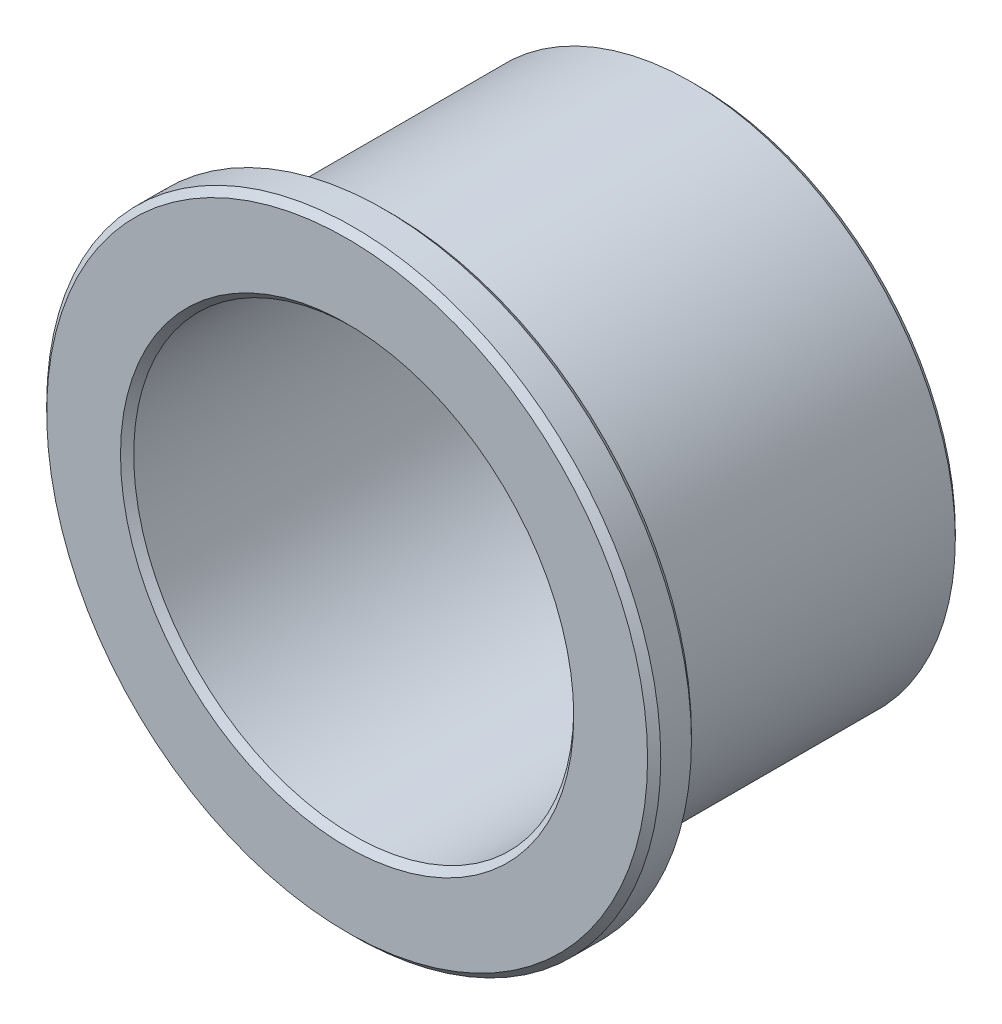
ISO-10303-21;
HEADER;
FILE_DESCRIPTION(('STEP AP214'),'2;1');
FILE_NAME('part.step','',(''),(''),'','','');
FILE_SCHEMA(('AUTOMOTIVE_DESIGN { 1 0 10303 214 1 1 1 1 }'));
ENDSEC;
DATA;
#1=APPLICATION_CONTEXT('core data for automotive mechanical design processes');
#2=APPLICATION_PROTOCOL_DEFINITION('international standard','automotive_design',2000,#1);
#3=PRODUCT_CONTEXT('',#1,'mechanical');
#4=PRODUCT('Part','Part','',(#3));
#5=PRODUCT_RELATED_PRODUCT_CATEGORY('part','',(#4));
#6=PRODUCT_DEFINITION_FORMATION('','',#4);
#7=PRODUCT_DEFINITION_CONTEXT('part definition',#1,'design');
#8=PRODUCT_DEFINITION('design','',#6,#7);
#9=PRODUCT_DEFINITION_SHAPE('','',#8);
#10=(LENGTH_UNIT() NAMED_UNIT(*) SI_UNIT(.MILLI.,.METRE.));
#11=(NAMED_UNIT(*) PLANE_ANGLE_UNIT() SI_UNIT($,.RADIAN.));
#12=(NAMED_UNIT(*) SI_UNIT($,.STERADIAN.) SOLID_ANGLE_UNIT());
#13=UNCERTAINTY_MEASURE_WITH_UNIT(LENGTH_MEASURE(1.E-05),#10,'distance_accuracy_value','');
#14=(GEOMETRIC_REPRESENTATION_CONTEXT(3) GLOBAL_UNCERTAINTY_ASSIGNED_CONTEXT((#13)) GLOBAL_UNIT_ASSIGNED_CONTEXT((#10,
#11,#12)) REPRESENTATION_CONTEXT('',''));
#15=CARTESIAN_POINT('',(0.,0.,0.));
#16=DIRECTION('',(0.,0.,1.));
#17=DIRECTION('',(1.,0.,0.));
#18=AXIS2_PLACEMENT_3D('',#15,#16,#17);
#19=CARTESIAN_POINT('',(0.,0.,4.7625));
#20=DIRECTION('',(0.,0.,1.));
#21=DIRECTION('',(1.,0.,0.));
#22=AXIS2_PLACEMENT_3D('',#19,#20,#21);
#23=CYLINDRICAL_SURFACE('',#22,11.1125);
#24=CARTESIAN_POINT('',(0.,0.,6.11111300000001));
#25=DIRECTION('',(0.,0.,1.));
#26=DIRECTION('',(1.,0.,0.));
#27=AXIS2_PLACEMENT_3D('',#24,#25,#26);
#28=CIRCLE('',#27,11.1125);
#29=CARTESIAN_POINT('',(11.1125,0.,6.11111300000001));
#30=VERTEX_POINT('',#29);
#31=EDGE_CURVE('E58',#30,#30,#28,.F.);
#32=ORIENTED_EDGE('',*,*,#31,.T.);
#33=EDGE_LOOP('',(#32));
#34=FACE_BOUND('',#33,.T.);
#35=CARTESIAN_POINT('',(0.,0.,5.001387));
#36=DIRECTION('',(0.,0.,1.));
#37=DIRECTION('',(1.,0.,0.));
#38=AXIS2_PLACEMENT_3D('',#35,#36,#37);
#39=CIRCLE('',#38,11.1125);
#40=CARTESIAN_POINT('',(11.1125,0.,5.001387));
#41=VERTEX_POINT('',#40);
#42=EDGE_CURVE('E61',#41,#41,#39,.T.);
#43=ORIENTED_EDGE('',*,*,#42,.T.);
#44=EDGE_LOOP('',(#43));
#45=FACE_BOUND('',#44,.T.);
#46=ADVANCED_FACE('F32',(#34,#45),#23,.T.);
#47=CARTESIAN_POINT('',(0.,0.,4.7625));
#48=DIRECTION('',(0.,0.,1.));
#49=DIRECTION('',(1.,0.,0.));
#50=AXIS2_PLACEMENT_3D('',#47,#48,#49);
#51=PLANE('',#50);
#52=CARTESIAN_POINT('',(0.,0.,4.7625));
#53=DIRECTION('',(0.,0.,1.));
#54=DIRECTION('',(1.,0.,0.));
#55=AXIS2_PLACEMENT_3D('',#52,#53,#54);
#56=CIRCLE('',#55,10.873613);
#57=CARTESIAN_POINT('',(10.873613,0.,4.7625));
#58=VERTEX_POINT('',#57);
#59=EDGE_CURVE('E52',#58,#58,#56,.F.);
#60=ORIENTED_EDGE('',*,*,#59,.T.);
#61=EDGE_LOOP('',(#60));
#62=FACE_BOUND('',#61,.T.);
#63=CARTESIAN_POINT('',(0.,0.,4.7625));
#64=DIRECTION('',(0.,0.,1.));
#65=DIRECTION('',(1.,0.,0.));
#66=AXIS2_PLACEMENT_3D('',#63,#64,#65);
#67=CIRCLE('',#66,9.78928700000001);
#68=CARTESIAN_POINT('',(9.78928700000001,0.,4.7625));
#69=VERTEX_POINT('',#68);
#70=EDGE_CURVE('E55',#69,#69,#67,.T.);
#71=ORIENTED_EDGE('',*,*,#70,.T.);
#72=EDGE_LOOP('',(#71));
#73=FACE_BOUND('',#72,.T.);
#74=ADVANCED_FACE('F92',(#62,#73),#51,.F.);
#75=CARTESIAN_POINT('',(0.,0.,6.35));
#76=DIRECTION('',(0.,0.,1.));
#77=DIRECTION('',(1.,0.,0.));
#78=AXIS2_PLACEMENT_3D('',#75,#76,#77);
#79=PLANE('',#78);
#80=CARTESIAN_POINT('',(0.,0.,6.35));
#81=DIRECTION('',(0.,0.,1.));
#82=DIRECTION('',(1.,0.,0.));
#83=AXIS2_PLACEMENT_3D('',#80,#81,#82);
#84=CIRCLE('',#83,8.201787);
#85=CARTESIAN_POINT('',(8.201787,0.,6.35));
#86=VERTEX_POINT('',#85);
#87=EDGE_CURVE('E64',#86,#86,#84,.F.);
#88=ORIENTED_EDGE('',*,*,#87,.T.);
#89=EDGE_LOOP('',(#88));
#90=FACE_BOUND('',#89,.T.);
#91=CARTESIAN_POINT('',(0.,0.,6.35));
#92=DIRECTION('',(0.,0.,1.));
#93=DIRECTION('',(1.,0.,0.));
#94=AXIS2_PLACEMENT_3D('',#91,#92,#93);
#95=CIRCLE('',#94,10.873613);
#96=CARTESIAN_POINT('',(10.873613,0.,6.35));
#97=VERTEX_POINT('',#96);
#98=EDGE_CURVE('E67',#97,#97,#95,.T.);
#99=ORIENTED_EDGE('',*,*,#98,.T.);
#100=EDGE_LOOP('',(#99));
#101=FACE_BOUND('',#100,.T.);
#102=ADVANCED_FACE('F98',(#90,#101),#79,.T.);
#103=CARTESIAN_POINT('',(0.,0.,4.7625));
#104=DIRECTION('',(0.,0.,1.));
#105=DIRECTION('',(1.,0.,0.));
#106=AXIS2_PLACEMENT_3D('',#103,#104,#105);
#107=CYLINDRICAL_SURFACE('',#106,7.9629);
#108=CARTESIAN_POINT('',(0.,0.,6.111113));
#109=DIRECTION('',(0.,0.,1.));
#110=DIRECTION('',(1.,0.,0.));
#111=AXIS2_PLACEMENT_3D('',#108,#109,#110);
#112=CIRCLE('',#111,7.9629);
#113=CARTESIAN_POINT('',(7.9629,0.,6.111113));
#114=VERTEX_POINT('',#113);
#115=EDGE_CURVE('E70',#114,#114,#112,.T.);
#116=ORIENTED_EDGE('',*,*,#115,.T.);
#117=EDGE_LOOP('',(#116));
#118=FACE_BOUND('',#117,.T.);
#119=CARTESIAN_POINT('',(0.,0.,-6.111113));
#120=DIRECTION('',(0.,0.,1.));
#121=DIRECTION('',(1.,0.,0.));
#122=AXIS2_PLACEMENT_3D('',#119,#120,#121);
#123=CIRCLE('',#122,7.9629);
#124=CARTESIAN_POINT('',(7.9629,0.,-6.111113));
#125=VERTEX_POINT('',#124);
#126=EDGE_CURVE('E73',#125,#125,#123,.F.);
#127=ORIENTED_EDGE('',*,*,#126,.T.);
#128=EDGE_LOOP('',(#127));
#129=FACE_BOUND('',#128,.T.);
#130=ADVANCED_FACE('F77',(#118,#129),#107,.F.);
#131=CARTESIAN_POINT('',(0.,0.,-6.35));
#132=DIRECTION('',(0.,0.,1.));
#133=DIRECTION('',(1.,0.,0.));
#134=AXIS2_PLACEMENT_3D('',#131,#132,#133);
#135=CYLINDRICAL_SURFACE('',#134,9.5504);
#136=CARTESIAN_POINT('',(0.,0.,4.52361299999999));
#137=DIRECTION('',(0.,0.,1.));
#138=DIRECTION('',(1.,0.,0.));
#139=AXIS2_PLACEMENT_3D('',#136,#137,#138);
#140=CIRCLE('',#139,9.5504);
#141=CARTESIAN_POINT('',(9.5504,0.,4.52361299999999));
#142=VERTEX_POINT('',#141);
#143=EDGE_CURVE('E43',#142,#142,#140,.F.);
#144=ORIENTED_EDGE('',*,*,#143,.T.);
#145=EDGE_LOOP('',(#144));
#146=FACE_BOUND('',#145,.T.);
#147=CARTESIAN_POINT('',(0.,0.,-6.111113));
#148=DIRECTION('',(0.,0.,1.));
#149=DIRECTION('',(1.,0.,0.));
#150=AXIS2_PLACEMENT_3D('',#147,#148,#149);
#151=CIRCLE('',#150,9.5504);
#152=CARTESIAN_POINT('',(9.5504,0.,-6.111113));
#153=VERTEX_POINT('',#152);
#154=EDGE_CURVE('E47',#153,#153,#151,.T.);
#155=ORIENTED_EDGE('',*,*,#154,.T.);
#156=EDGE_LOOP('',(#155));
#157=FACE_BOUND('',#156,.T.);
#158=ADVANCED_FACE('F160',(#146,#157),#135,.T.);
#159=CARTESIAN_POINT('',(0.,0.,-6.35));
#160=DIRECTION('',(0.,0.,1.));
#161=DIRECTION('',(1.,0.,0.));
#162=AXIS2_PLACEMENT_3D('',#159,#160,#161);
#163=PLANE('',#162);
#164=CARTESIAN_POINT('',(0.,0.,-6.35));
#165=DIRECTION('',(0.,0.,1.));
#166=DIRECTION('',(1.,0.,0.));
#167=AXIS2_PLACEMENT_3D('',#164,#165,#166);
#168=CIRCLE('',#167,8.201787);
#169=CARTESIAN_POINT('',(8.201787,0.,-6.35));
#170=VERTEX_POINT('',#169);
#171=EDGE_CURVE('E10',#170,#170,#168,.T.);
#172=ORIENTED_EDGE('',*,*,#171,.T.);
#173=EDGE_LOOP('',(#172));
#174=FACE_BOUND('',#173,.T.);
#175=CARTESIAN_POINT('',(0.,0.,-6.35));
#176=DIRECTION('',(0.,0.,1.));
#177=DIRECTION('',(1.,0.,0.));
#178=AXIS2_PLACEMENT_3D('',#175,#176,#177);
#179=CIRCLE('',#178,9.311513);
#180=CARTESIAN_POINT('',(9.311513,0.,-6.35));
#181=VERTEX_POINT('',#180);
#182=EDGE_CURVE('E39',#181,#181,#179,.F.);
#183=ORIENTED_EDGE('',*,*,#182,.T.);
#184=EDGE_LOOP('',(#183));
#185=FACE_BOUND('',#184,.T.);
#186=ADVANCED_FACE('F108',(#174,#185),#163,.F.);
#187=CARTESIAN_POINT('',(0.,0.,6.111113));
#188=DIRECTION('',(0.,0.,1.));
#189=DIRECTION('',(1.,0.,0.));
#190=AXIS2_PLACEMENT_3D('',#187,#188,#189);
#191=CONICAL_SURFACE('',#190,7.9629,0.785398163397445);
#192=ORIENTED_EDGE('',*,*,#87,.F.);
#193=EDGE_LOOP('',(#192));
#194=FACE_BOUND('',#193,.T.);
#195=ORIENTED_EDGE('',*,*,#115,.F.);
#196=EDGE_LOOP('',(#195));
#197=FACE_BOUND('',#196,.T.);
#198=ADVANCED_FACE('F104',(#194,#197),#191,.F.);
#199=CARTESIAN_POINT('',(0.,0.,6.35));
#200=DIRECTION('',(0.,0.,-1.));
#201=DIRECTION('',(-1.,0.,0.));
#202=AXIS2_PLACEMENT_3D('',#199,#200,#201);
#203=CONICAL_SURFACE('',#202,10.873613,0.785398163397463);
#204=ORIENTED_EDGE('',*,*,#31,.F.);
#205=EDGE_LOOP('',(#204));
#206=FACE_BOUND('',#205,.T.);
#207=ORIENTED_EDGE('',*,*,#98,.F.);
#208=EDGE_LOOP('',(#207));
#209=FACE_BOUND('',#208,.T.);
#210=ADVANCED_FACE('F107',(#206,#209),#203,.T.);
#211=CARTESIAN_POINT('',(0.,0.,5.001387));
#212=DIRECTION('',(0.,0.,1.));
#213=DIRECTION('',(1.,0.,0.));
#214=AXIS2_PLACEMENT_3D('',#211,#212,#213);
#215=CONICAL_SURFACE('',#214,11.1125,0.785398163397441);
#216=CARTESIAN_POINT('',(10.873613,0.,4.7625));
#217=CARTESIAN_POINT('',(10.87610140625,0.,4.76498840625));
#218=CARTESIAN_POINT('',(10.8785898125,0.,4.7674768125));
#219=CARTESIAN_POINT('',(10.883566625,0.,4.772453625));
#220=CARTESIAN_POINT('',(10.88605503125,0.,4.77494203125));
#221=CARTESIAN_POINT('',(10.89103184375,0.,4.77991884375));
#222=CARTESIAN_POINT('',(10.89352025,0.,4.78240725));
#223=CARTESIAN_POINT('',(10.8984970625,0.,4.7873840625));
#224=CARTESIAN_POINT('',(10.90098546875,0.,4.78987246875));
#225=CARTESIAN_POINT('',(10.90596228125,0.,4.79484928125));
#226=CARTESIAN_POINT('',(10.9084506875,0.,4.7973376875));
#227=CARTESIAN_POINT('',(10.9134275,0.,4.8023145));
#228=CARTESIAN_POINT('',(10.91591590625,0.,4.80480290625));
#229=CARTESIAN_POINT('',(10.92089271875,0.,4.80977971875));
#230=CARTESIAN_POINT('',(10.923381125,0.,4.812268125));
#231=CARTESIAN_POINT('',(10.9283579375,0.,4.8172449375));
#232=CARTESIAN_POINT('',(10.93084634375,0.,4.81973334375));
#233=CARTESIAN_POINT('',(10.93582315625,0.,4.82471015625));
#234=CARTESIAN_POINT('',(10.9383115625,0.,4.8271985625));
#235=CARTESIAN_POINT('',(10.943288375,0.,4.832175375));
#236=CARTESIAN_POINT('',(10.94577678125,0.,4.83466378125));
#237=CARTESIAN_POINT('',(10.95075359375,0.,4.83964059375));
#238=CARTESIAN_POINT('',(10.953242,0.,4.842129));
#239=CARTESIAN_POINT('',(10.9582188125,0.,4.8471058125));
#240=CARTESIAN_POINT('',(10.96070721875,0.,4.84959421875));
#241=CARTESIAN_POINT('',(10.96568403125,0.,4.85457103125));
#242=CARTESIAN_POINT('',(10.9681724375,0.,4.8570594375));
#243=CARTESIAN_POINT('',(10.97314925,0.,4.86203625));
#244=CARTESIAN_POINT('',(10.97563765625,0.,4.86452465625));
#245=CARTESIAN_POINT('',(10.98061446875,0.,4.86950146875));
#246=CARTESIAN_POINT('',(10.983102875,0.,4.871989875));
#247=CARTESIAN_POINT('',(10.9880796875,0.,4.8769666875));
#248=CARTESIAN_POINT('',(10.99056809375,0.,4.87945509375));
#249=CARTESIAN_POINT('',(10.99554490625,0.,4.88443190625));
#250=CARTESIAN_POINT('',(10.9980333125,0.,4.8869203125));
#251=CARTESIAN_POINT('',(11.003010125,0.,4.891897125));
#252=CARTESIAN_POINT('',(11.00549853125,0.,4.89438553125));
#253=CARTESIAN_POINT('',(11.01047534375,0.,4.89936234375));
#254=CARTESIAN_POINT('',(11.01296375,0.,4.90185075));
#255=CARTESIAN_POINT('',(11.0179405625,0.,4.9068275625));
#256=CARTESIAN_POINT('',(11.02042896875,0.,4.90931596875));
#257=CARTESIAN_POINT('',(11.02540578125,0.,4.91429278125));
#258=CARTESIAN_POINT('',(11.0278941875,0.,4.9167811875));
#259=CARTESIAN_POINT('',(11.032871,0.,4.921758));
#260=CARTESIAN_POINT('',(11.03535940625,0.,4.92424640625));
#261=CARTESIAN_POINT('',(11.04033621875,0.,4.92922321875));
#262=CARTESIAN_POINT('',(11.042824625,0.,4.931711625));
#263=CARTESIAN_POINT('',(11.0478014375,0.,4.9366884375));
#264=CARTESIAN_POINT('',(11.05028984375,0.,4.93917684375));
#265=CARTESIAN_POINT('',(11.05526665625,0.,4.94415365625));
#266=CARTESIAN_POINT('',(11.0577550625,0.,4.9466420625));
#267=CARTESIAN_POINT('',(11.062731875,0.,4.951618875));
#268=CARTESIAN_POINT('',(11.06522028125,0.,4.95410728125));
#269=CARTESIAN_POINT('',(11.07019709375,0.,4.95908409375));
#270=CARTESIAN_POINT('',(11.0726855,0.,4.9615725));
#271=CARTESIAN_POINT('',(11.0776623125,0.,4.9665493125));
#272=CARTESIAN_POINT('',(11.08015071875,0.,4.96903771875));
#273=CARTESIAN_POINT('',(11.08512753125,0.,4.97401453125));
#274=CARTESIAN_POINT('',(11.0876159375,0.,4.9765029375));
#275=CARTESIAN_POINT('',(11.09259275,0.,4.98147975));
#276=CARTESIAN_POINT('',(11.09508115625,0.,4.98396815625));
#277=CARTESIAN_POINT('',(11.10005796875,0.,4.98894496875));
#278=CARTESIAN_POINT('',(11.102546375,0.,4.991433375));
#279=CARTESIAN_POINT('',(11.1075231875,0.,4.9964101875));
#280=CARTESIAN_POINT('',(11.11001159375,0.,4.99889859375));
#281=CARTESIAN_POINT('',(11.1125,0.,5.001387));
#282=B_SPLINE_CURVE_WITH_KNOTS('',3,(#216,#217,#218,#219,#220,#221,#222,#223,#224,#225,#226,
#227,#228,#229,#230,#231,#232,#233,#234,#235,#236,#237,#238,#239,#240,#241,#242,#243,#244,#245,
#246,#247,#248,#249,#250,#251,#252,#253,#254,#255,#256,#257,#258,#259,#260,#261,#262,#263,#264,
#265,#266,#267,#268,#269,#270,#271,#272,#273,#274,#275,#276,#277,#278,#279,#280,#281),
.UNSPECIFIED.,.F.,.F.,(4,2,2,2,2,2,2,2,2,2,2,2,2,2,2,2,2,2,2,2,2,2,2,2,2,2,2,2,2,2,2,2,4),(0.,
0.0105574136023316,0.0211148272046639,0.0316722408069967,0.0422296544093277,0.05278706801166,
0.0633444816139916,0.0739018952163238,0.084459308818656,0.0950167224209877,0.10557413602332,
0.116131549625653,0.126688963227984,0.137246376830316,0.147803790432648,0.15836120403498,
0.168918617637312,0.179476031239644,0.190033444841976,0.200590858444309,0.21114827204664,
0.221705685648972,0.232263099251304,0.242820512853636,0.253377926455969,0.2639353400583,
0.274492753660632,0.285050167262965,0.295607580865296,0.306164994467628,0.31672240806996,
0.327279821672292,0.337837235274625),.UNSPECIFIED.);
#283=EDGE_CURVE('BSEAM88',#58,#41,#282,.T.);
#284=ORIENTED_EDGE('',*,*,#59,.F.);
#285=ORIENTED_EDGE('',*,*,#42,.F.);
#286=ORIENTED_EDGE('',*,*,#283,.T.);
#287=ORIENTED_EDGE('',*,*,#283,.F.);
#288=EDGE_LOOP('',(#284,#286,#285,#287));
#289=FACE_BOUND('',#288,.T.);
#290=ADVANCED_FACE('F88',(#289),#215,.T.);
#291=CARTESIAN_POINT('',(0.,0.,4.7625));
#292=DIRECTION('',(0.,0.,1.));
#293=DIRECTION('',(1.,0.,0.));
#294=AXIS2_PLACEMENT_3D('',#291,#292,#293);
#295=CONICAL_SURFACE('',#294,9.78928700000001,0.785398163397456);
#296=CARTESIAN_POINT('',(9.5504,0.,4.52361299999999));
#297=CARTESIAN_POINT('',(9.55288840625,0.,4.52610140624999));
#298=CARTESIAN_POINT('',(9.5553768125,0.,4.52858981249999));
#299=CARTESIAN_POINT('',(9.560353625,0.,4.53356662499999));
#300=CARTESIAN_POINT('',(9.56284203125,0.,4.53605503124999));
#301=CARTESIAN_POINT('',(9.56781884375,0.,4.54103184374999));
#302=CARTESIAN_POINT('',(9.57030725,0.,4.54352024999999));
#303=CARTESIAN_POINT('',(9.5752840625,0.,4.54849706249999));
#304=CARTESIAN_POINT('',(9.57777246875,0.,4.55098546874999));
#305=CARTESIAN_POINT('',(9.58274928125,0.,4.55596228124999));
#306=CARTESIAN_POINT('',(9.5852376875,0.,4.55845068749999));
#307=CARTESIAN_POINT('',(9.5902145,0.,4.56342749999999));
#308=CARTESIAN_POINT('',(9.59270290625,0.,4.56591590624999));
#309=CARTESIAN_POINT('',(9.59767971875,0.,4.57089271874999));
#310=CARTESIAN_POINT('',(9.600168125,0.,4.57338112499999));
#311=CARTESIAN_POINT('',(9.6051449375,0.,4.57835793749999));
#312=CARTESIAN_POINT('',(9.60763334375,0.,4.58084634374999));
#313=CARTESIAN_POINT('',(9.61261015625,0.,4.58582315624999));
#314=CARTESIAN_POINT('',(9.6150985625,0.,4.5883115625));
#315=CARTESIAN_POINT('',(9.620075375,0.,4.59328837499999));
#316=CARTESIAN_POINT('',(9.62256378125,0.,4.59577678124999));
#317=CARTESIAN_POINT('',(9.62754059375,0.,4.60075359374999));
#318=CARTESIAN_POINT('',(9.630029,0.,4.603242));
#319=CARTESIAN_POINT('',(9.6350058125,0.,4.6082188125));
#320=CARTESIAN_POINT('',(9.63749421875,0.,4.61070721874999));
#321=CARTESIAN_POINT('',(9.64247103125,0.,4.61568403124999));
#322=CARTESIAN_POINT('',(9.6449594375,0.,4.61817243749999));
#323=CARTESIAN_POINT('',(9.64993625,0.,4.62314924999999));
#324=CARTESIAN_POINT('',(9.65242465625,0.,4.62563765625));
#325=CARTESIAN_POINT('',(9.65740146875,0.,4.63061446875));
#326=CARTESIAN_POINT('',(9.659889875,0.,4.633102875));
#327=CARTESIAN_POINT('',(9.6648666875,0.,4.63807968749999));
#328=CARTESIAN_POINT('',(9.66735509375,0.,4.64056809375));
#329=CARTESIAN_POINT('',(9.67233190625,0.,4.64554490625));
#330=CARTESIAN_POINT('',(9.6748203125,0.,4.6480333125));
#331=CARTESIAN_POINT('',(9.679797125,0.,4.653010125));
#332=CARTESIAN_POINT('',(9.68228553125,0.,4.65549853125));
#333=CARTESIAN_POINT('',(9.68726234375,0.,4.66047534375));
#334=CARTESIAN_POINT('',(9.68975075,0.,4.66296375));
#335=CARTESIAN_POINT('',(9.69472756250001,0.,4.6679405625));
#336=CARTESIAN_POINT('',(9.69721596875,0.,4.67042896875));
#337=CARTESIAN_POINT('',(9.70219278125,0.,4.67540578125));
#338=CARTESIAN_POINT('',(9.70468118750001,0.,4.6778941875));
#339=CARTESIAN_POINT('',(9.709658,0.,4.682871));
#340=CARTESIAN_POINT('',(9.71214640625,0.,4.68535940625));
#341=CARTESIAN_POINT('',(9.71712321875001,0.,4.69033621875));
#342=CARTESIAN_POINT('',(9.719611625,0.,4.692824625));
#343=CARTESIAN_POINT('',(9.72458843750001,0.,4.6978014375));
#344=CARTESIAN_POINT('',(9.72707684375001,0.,4.70028984375));
#345=CARTESIAN_POINT('',(9.73205365625,0.,4.70526665625));
#346=CARTESIAN_POINT('',(9.73454206250001,0.,4.7077550625));
#347=CARTESIAN_POINT('',(9.73951887500001,0.,4.712731875));
#348=CARTESIAN_POINT('',(9.74200728125,0.,4.71522028125));
#349=CARTESIAN_POINT('',(9.74698409375001,0.,4.72019709375));
#350=CARTESIAN_POINT('',(9.7494725,0.,4.7226855));
#351=CARTESIAN_POINT('',(9.75444931250001,0.,4.7276623125));
#352=CARTESIAN_POINT('',(9.75693771875001,0.,4.73015071875));
#353=CARTESIAN_POINT('',(9.76191453125001,0.,4.73512753125));
#354=CARTESIAN_POINT('',(9.76440293750001,0.,4.7376159375));
#355=CARTESIAN_POINT('',(9.76937975000001,0.,4.74259275));
#356=CARTESIAN_POINT('',(9.77186815625001,0.,4.74508115625));
#357=CARTESIAN_POINT('',(9.77684496875001,0.,4.75005796875));
#358=CARTESIAN_POINT('',(9.77933337500001,0.,4.752546375));
#359=CARTESIAN_POINT('',(9.78431018750001,0.,4.7575231875));
#360=CARTESIAN_POINT('',(9.78679859375001,0.,4.76001159375));
#361=CARTESIAN_POINT('',(9.78928700000001,0.,4.7625));
#362=B_SPLINE_CURVE_WITH_KNOTS('',3,(#296,#297,#298,#299,#300,#301,#302,#303,#304,#305,#306,
#307,#308,#309,#310,#311,#312,#313,#314,#315,#316,#317,#318,#319,#320,#321,#322,#323,#324,#325,
#326,#327,#328,#329,#330,#331,#332,#333,#334,#335,#336,#337,#338,#339,#340,#341,#342,#343,#344,
#345,#346,#347,#348,#349,#350,#351,#352,#353,#354,#355,#356,#357,#358,#359,#360,#361),
.UNSPECIFIED.,.F.,.F.,(4,2,2,2,2,2,2,2,2,2,2,2,2,2,2,2,2,2,2,2,2,2,2,2,2,2,2,2,2,2,2,2,4),(0.,
0.0105574136023316,0.0211148272046639,0.0316722408069967,0.0422296544093289,0.05278706801166,
0.0633444816139928,0.073901895216325,0.0844593088186573,0.0950167224209889,0.105574136023321,
0.116131549625654,0.126688963227986,0.137246376830317,0.14780379043265,0.158361204034982,
0.168918617637315,0.179476031239646,0.190033444841978,0.200590858444311,0.211148272046644,
0.221705685648975,0.232263099251307,0.24282051285364,0.253377926455972,0.263935340058303,
0.274492753660636,0.285050167262969,0.295607580865301,0.306164994467632,0.316722408069965,
0.327279821672297,0.33783723527463),.UNSPECIFIED.);
#363=EDGE_CURVE('BSEAM82',#142,#69,#362,.T.);
#364=ORIENTED_EDGE('',*,*,#143,.F.);
#365=ORIENTED_EDGE('',*,*,#70,.F.);
#366=ORIENTED_EDGE('',*,*,#363,.T.);
#367=ORIENTED_EDGE('',*,*,#363,.F.);
#368=EDGE_LOOP('',(#364,#366,#365,#367));
#369=FACE_BOUND('',#368,.T.);
#370=ADVANCED_FACE('F82',(#369),#295,.T.);
#371=CARTESIAN_POINT('',(0.,0.,-6.35));
#372=DIRECTION('',(0.,0.,-1.));
#373=DIRECTION('',(-1.,0.,0.));
#374=AXIS2_PLACEMENT_3D('',#371,#372,#373);
#375=CONICAL_SURFACE('',#374,8.201787,0.785398163397455);
#376=ORIENTED_EDGE('',*,*,#126,.F.);
#377=EDGE_LOOP('',(#376));
#378=FACE_BOUND('',#377,.T.);
#379=ORIENTED_EDGE('',*,*,#171,.F.);
#380=EDGE_LOOP('',(#379));
#381=FACE_BOUND('',#380,.T.);
#382=ADVANCED_FACE('F79',(#378,#381),#375,.F.);
#383=CARTESIAN_POINT('',(0.,0.,-6.111113));
#384=DIRECTION('',(0.,0.,1.));
#385=DIRECTION('',(1.,0.,0.));
#386=AXIS2_PLACEMENT_3D('',#383,#384,#385);
#387=CONICAL_SURFACE('',#386,9.5504,0.785398163397445);
#388=ORIENTED_EDGE('',*,*,#182,.F.);
#389=EDGE_LOOP('',(#388));
#390=FACE_BOUND('',#389,.T.);
#391=ORIENTED_EDGE('',*,*,#154,.F.);
#392=EDGE_LOOP('',(#391));
#393=FACE_BOUND('',#392,.T.);
#394=ADVANCED_FACE('F34',(#390,#393),#387,.T.);
#395=CLOSED_SHELL('',(#46,#74,#102,#130,#158,#186,#198,#210,#290,#370,#382,#394));
#396=MANIFOLD_SOLID_BREP('B2',#395);
#397=ADVANCED_BREP_SHAPE_REPRESENTATION('',(#18,#396),#14);
#398=SHAPE_DEFINITION_REPRESENTATION(#9,#397);
ENDSEC;
END-ISO-10303-21;
